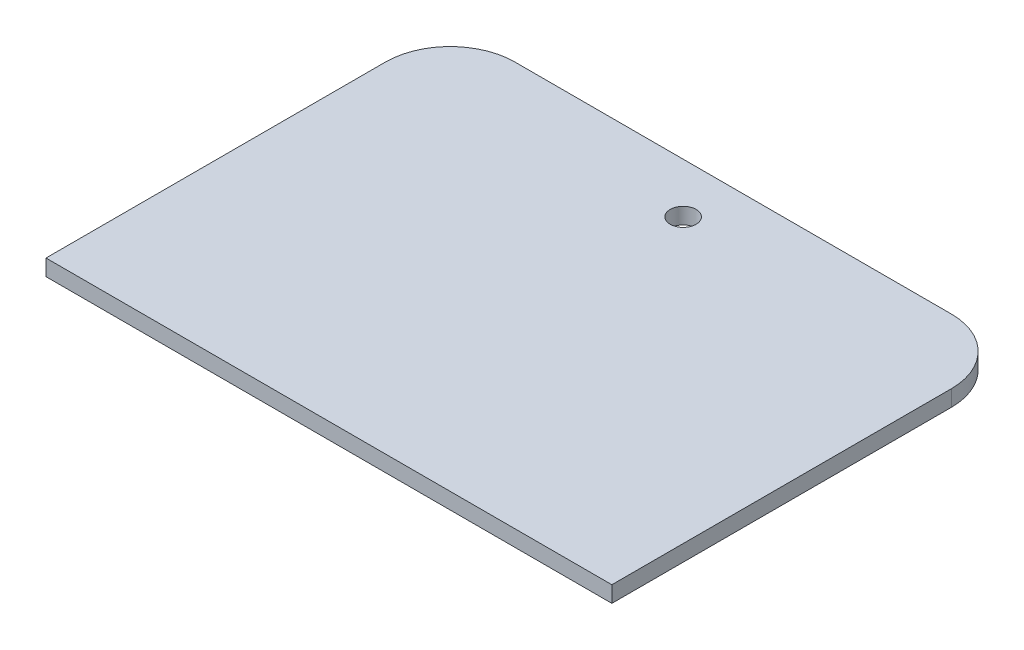
ISO-10303-21;
HEADER;
FILE_DESCRIPTION(('STEP AP214'),'2;1');
FILE_NAME('part.step','',(''),(''),'','','');
FILE_SCHEMA(('AUTOMOTIVE_DESIGN { 1 0 10303 214 1 1 1 1 }'));
ENDSEC;
DATA;
#1=APPLICATION_CONTEXT('core data for automotive mechanical design processes');
#2=APPLICATION_PROTOCOL_DEFINITION('international standard','automotive_design',2000,#1);
#3=PRODUCT_CONTEXT('',#1,'mechanical');
#4=PRODUCT('Part','Part','',(#3));
#5=PRODUCT_RELATED_PRODUCT_CATEGORY('part','',(#4));
#6=PRODUCT_DEFINITION_FORMATION('','',#4);
#7=PRODUCT_DEFINITION_CONTEXT('part definition',#1,'design');
#8=PRODUCT_DEFINITION('design','',#6,#7);
#9=PRODUCT_DEFINITION_SHAPE('','',#8);
#10=(LENGTH_UNIT() NAMED_UNIT(*) SI_UNIT(.MILLI.,.METRE.));
#11=(NAMED_UNIT(*) PLANE_ANGLE_UNIT() SI_UNIT($,.RADIAN.));
#12=(NAMED_UNIT(*) SI_UNIT($,.STERADIAN.) SOLID_ANGLE_UNIT());
#13=UNCERTAINTY_MEASURE_WITH_UNIT(LENGTH_MEASURE(1.E-05),#10,'distance_accuracy_value','');
#14=(GEOMETRIC_REPRESENTATION_CONTEXT(3) GLOBAL_UNCERTAINTY_ASSIGNED_CONTEXT((#13)) GLOBAL_UNIT_ASSIGNED_CONTEXT((#10,
#11,#12)) REPRESENTATION_CONTEXT('',''));
#15=CARTESIAN_POINT('',(0.,0.,0.));
#16=DIRECTION('',(0.,0.,1.));
#17=DIRECTION('',(1.,0.,0.));
#18=AXIS2_PLACEMENT_3D('',#15,#16,#17);
#19=CARTESIAN_POINT('',(35.,2.,-25.));
#20=DIRECTION('',(-1.,0.,0.));
#21=DIRECTION('',(0.,0.,1.));
#22=AXIS2_PLACEMENT_3D('',#19,#20,#21);
#23=PLANE('',#22);
#24=DIRECTION('',(0.,0.,-1.));
#25=VECTOR('',#24,1.);
#26=CARTESIAN_POINT('',(35.,0.,-25.));
#27=LINE('',#26,#25);
#28=CARTESIAN_POINT('',(35.,0.,25.));
#29=VERTEX_POINT('',#28);
#30=CARTESIAN_POINT('',(35.,0.,-17.));
#31=VERTEX_POINT('',#30);
#32=EDGE_CURVE('E113',#29,#31,#27,.T.);
#33=ORIENTED_EDGE('',*,*,#32,.T.);
#34=DIRECTION('',(0.,-1.,0.));
#35=VECTOR('',#34,1.);
#36=CARTESIAN_POINT('',(35.,2.,-17.));
#37=LINE('',#36,#35);
#38=CARTESIAN_POINT('',(35.,2.,-17.));
#39=VERTEX_POINT('',#38);
#40=EDGE_CURVE('E57',#31,#39,#37,.F.);
#41=ORIENTED_EDGE('',*,*,#40,.T.);
#42=DIRECTION('',(0.,0.,-1.));
#43=VECTOR('',#42,1.);
#44=CARTESIAN_POINT('',(35.,2.,-25.));
#45=LINE('',#44,#43);
#46=CARTESIAN_POINT('',(35.,2.,25.));
#47=VERTEX_POINT('',#46);
#48=EDGE_CURVE('E121',#47,#39,#45,.T.);
#49=ORIENTED_EDGE('',*,*,#48,.F.);
#50=DIRECTION('',(0.,-1.,0.));
#51=VECTOR('',#50,1.);
#52=CARTESIAN_POINT('',(35.,2.,25.));
#53=LINE('',#52,#51);
#54=EDGE_CURVE('E105',#47,#29,#53,.T.);
#55=ORIENTED_EDGE('',*,*,#54,.T.);
#56=EDGE_LOOP('',(#33,#41,#49,#55));
#57=FACE_BOUND('',#56,.T.);
#58=ADVANCED_FACE('F34',(#57),#23,.F.);
#59=CARTESIAN_POINT('',(-35.,2.,-25.));
#60=DIRECTION('',(0.,0.,1.));
#61=DIRECTION('',(1.,0.,0.));
#62=AXIS2_PLACEMENT_3D('',#59,#60,#61);
#63=PLANE('',#62);
#64=DIRECTION('',(-1.,0.,0.));
#65=VECTOR('',#64,1.);
#66=CARTESIAN_POINT('',(-35.,2.,-25.));
#67=LINE('',#66,#65);
#68=CARTESIAN_POINT('',(27.,2.,-25.));
#69=VERTEX_POINT('',#68);
#70=CARTESIAN_POINT('',(-27.,2.,-25.));
#71=VERTEX_POINT('',#70);
#72=EDGE_CURVE('E95',#69,#71,#67,.T.);
#73=ORIENTED_EDGE('',*,*,#72,.F.);
#74=DIRECTION('',(0.,-1.,0.));
#75=VECTOR('',#74,1.);
#76=CARTESIAN_POINT('',(27.,2.,-25.));
#77=LINE('',#76,#75);
#78=CARTESIAN_POINT('',(27.,0.,-25.));
#79=VERTEX_POINT('',#78);
#80=EDGE_CURVE('E124',#69,#79,#77,.T.);
#81=ORIENTED_EDGE('',*,*,#80,.T.);
#82=DIRECTION('',(-1.,0.,0.));
#83=VECTOR('',#82,1.);
#84=CARTESIAN_POINT('',(-35.,0.,-25.));
#85=LINE('',#84,#83);
#86=CARTESIAN_POINT('',(-27.,0.,-25.));
#87=VERTEX_POINT('',#86);
#88=EDGE_CURVE('E115',#79,#87,#85,.T.);
#89=ORIENTED_EDGE('',*,*,#88,.T.);
#90=DIRECTION('',(0.,-1.,0.));
#91=VECTOR('',#90,1.);
#92=CARTESIAN_POINT('',(-27.,2.,-25.));
#93=LINE('',#92,#91);
#94=EDGE_CURVE('E104',#87,#71,#93,.F.);
#95=ORIENTED_EDGE('',*,*,#94,.T.);
#96=EDGE_LOOP('',(#73,#81,#89,#95));
#97=FACE_BOUND('',#96,.T.);
#98=ADVANCED_FACE('F137',(#97),#63,.F.);
#99=CARTESIAN_POINT('',(-35.,2.,-25.));
#100=DIRECTION('',(1.,0.,0.));
#101=DIRECTION('',(0.,0.,-1.));
#102=AXIS2_PLACEMENT_3D('',#99,#100,#101);
#103=PLANE('',#102);
#104=DIRECTION('',(0.,0.,1.));
#105=VECTOR('',#104,1.);
#106=CARTESIAN_POINT('',(-35.,2.,-25.));
#107=LINE('',#106,#105);
#108=CARTESIAN_POINT('',(-35.,2.,-17.));
#109=VERTEX_POINT('',#108);
#110=CARTESIAN_POINT('',(-35.,2.,25.));
#111=VERTEX_POINT('',#110);
#112=EDGE_CURVE('E87',#109,#111,#107,.T.);
#113=ORIENTED_EDGE('',*,*,#112,.F.);
#114=DIRECTION('',(0.,-1.,0.));
#115=VECTOR('',#114,1.);
#116=CARTESIAN_POINT('',(-35.,2.,-17.));
#117=LINE('',#116,#115);
#118=CARTESIAN_POINT('',(-35.,0.,-17.));
#119=VERTEX_POINT('',#118);
#120=EDGE_CURVE('E11',#109,#119,#117,.T.);
#121=ORIENTED_EDGE('',*,*,#120,.T.);
#122=DIRECTION('',(0.,0.,1.));
#123=VECTOR('',#122,1.);
#124=CARTESIAN_POINT('',(-35.,0.,-25.));
#125=LINE('',#124,#123);
#126=CARTESIAN_POINT('',(-35.,0.,25.));
#127=VERTEX_POINT('',#126);
#128=EDGE_CURVE('E101',#119,#127,#125,.T.);
#129=ORIENTED_EDGE('',*,*,#128,.T.);
#130=DIRECTION('',(0.,-1.,0.));
#131=VECTOR('',#130,1.);
#132=CARTESIAN_POINT('',(-35.,2.,25.));
#133=LINE('',#132,#131);
#134=EDGE_CURVE('E98',#111,#127,#133,.T.);
#135=ORIENTED_EDGE('',*,*,#134,.F.);
#136=EDGE_LOOP('',(#113,#121,#129,#135));
#137=FACE_BOUND('',#136,.T.);
#138=ADVANCED_FACE('F99',(#137),#103,.F.);
#139=CARTESIAN_POINT('',(-35.,2.,25.));
#140=DIRECTION('',(0.,0.,-1.));
#141=DIRECTION('',(-1.,0.,0.));
#142=AXIS2_PLACEMENT_3D('',#139,#140,#141);
#143=PLANE('',#142);
#144=DIRECTION('',(1.,0.,0.));
#145=VECTOR('',#144,1.);
#146=CARTESIAN_POINT('',(-35.,0.,25.));
#147=LINE('',#146,#145);
#148=EDGE_CURVE('E120',#127,#29,#147,.T.);
#149=ORIENTED_EDGE('',*,*,#148,.T.);
#150=ORIENTED_EDGE('',*,*,#54,.F.);
#151=DIRECTION('',(1.,0.,0.));
#152=VECTOR('',#151,1.);
#153=CARTESIAN_POINT('',(-35.,2.,25.));
#154=LINE('',#153,#152);
#155=EDGE_CURVE('E91',#111,#47,#154,.T.);
#156=ORIENTED_EDGE('',*,*,#155,.F.);
#157=ORIENTED_EDGE('',*,*,#134,.T.);
#158=EDGE_LOOP('',(#149,#150,#156,#157));
#159=FACE_BOUND('',#158,.T.);
#160=ADVANCED_FACE('F107',(#159),#143,.F.);
#161=CARTESIAN_POINT('',(0.,2.,0.));
#162=DIRECTION('',(0.,1.,0.));
#163=DIRECTION('',(0.,0.,1.));
#164=AXIS2_PLACEMENT_3D('',#161,#162,#163);
#165=PLANE('',#164);
#166=CARTESIAN_POINT('',(0.,2.,-18.8196601125011));
#167=DIRECTION('',(0.,1.,0.));
#168=DIRECTION('',(0.,0.,1.));
#169=AXIS2_PLACEMENT_3D('',#166,#167,#168);
#170=CIRCLE('',#169,1.6);
#171=CARTESIAN_POINT('',(0.,2.,-17.2196601125011));
#172=VERTEX_POINT('',#171);
#173=EDGE_CURVE('E148',#172,#172,#170,.T.);
#174=ORIENTED_EDGE('',*,*,#173,.F.);
#175=EDGE_LOOP('',(#174));
#176=FACE_BOUND('',#175,.T.);
#177=ORIENTED_EDGE('',*,*,#48,.T.);
#178=CARTESIAN_POINT('',(27.,2.,-17.));
#179=DIRECTION('',(0.,1.,0.));
#180=DIRECTION('',(0.,0.,1.));
#181=AXIS2_PLACEMENT_3D('',#178,#179,#180);
#182=CIRCLE('',#181,8.);
#183=EDGE_CURVE('E42',#39,#69,#182,.T.);
#184=ORIENTED_EDGE('',*,*,#183,.T.);
#185=ORIENTED_EDGE('',*,*,#72,.T.);
#186=CARTESIAN_POINT('',(-27.,2.,-17.));
#187=DIRECTION('',(0.,1.,0.));
#188=DIRECTION('',(0.,0.,1.));
#189=AXIS2_PLACEMENT_3D('',#186,#187,#188);
#190=CIRCLE('',#189,8.);
#191=EDGE_CURVE('E49',#71,#109,#190,.T.);
#192=ORIENTED_EDGE('',*,*,#191,.T.);
#193=ORIENTED_EDGE('',*,*,#112,.T.);
#194=ORIENTED_EDGE('',*,*,#155,.T.);
#195=EDGE_LOOP('',(#177,#184,#185,#192,#193,#194));
#196=FACE_BOUND('',#195,.T.);
#197=ADVANCED_FACE('F89',(#176,#196),#165,.T.);
#198=CARTESIAN_POINT('',(0.,0.,0.));
#199=DIRECTION('',(0.,1.,0.));
#200=DIRECTION('',(0.,0.,1.));
#201=AXIS2_PLACEMENT_3D('',#198,#199,#200);
#202=PLANE('',#201);
#203=CARTESIAN_POINT('',(0.,0.,-18.8196601125011));
#204=DIRECTION('',(0.,1.,0.));
#205=DIRECTION('',(0.,0.,1.));
#206=AXIS2_PLACEMENT_3D('',#203,#204,#205);
#207=CIRCLE('',#206,1.6);
#208=CARTESIAN_POINT('',(0.,0.,-17.2196601125011));
#209=VERTEX_POINT('',#208);
#210=EDGE_CURVE('E116',#209,#209,#207,.F.);
#211=ORIENTED_EDGE('',*,*,#210,.F.);
#212=EDGE_LOOP('',(#211));
#213=FACE_BOUND('',#212,.T.);
#214=ORIENTED_EDGE('',*,*,#88,.F.);
#215=CARTESIAN_POINT('',(27.,0.,-17.));
#216=DIRECTION('',(0.,1.,0.));
#217=DIRECTION('',(0.,0.,1.));
#218=AXIS2_PLACEMENT_3D('',#215,#216,#217);
#219=CIRCLE('',#218,8.);
#220=EDGE_CURVE('E129',#79,#31,#219,.F.);
#221=ORIENTED_EDGE('',*,*,#220,.T.);
#222=ORIENTED_EDGE('',*,*,#32,.F.);
#223=ORIENTED_EDGE('',*,*,#148,.F.);
#224=ORIENTED_EDGE('',*,*,#128,.F.);
#225=CARTESIAN_POINT('',(-27.,0.,-17.));
#226=DIRECTION('',(0.,1.,0.));
#227=DIRECTION('',(0.,0.,1.));
#228=AXIS2_PLACEMENT_3D('',#225,#226,#227);
#229=CIRCLE('',#228,8.);
#230=EDGE_CURVE('E127',#119,#87,#229,.F.);
#231=ORIENTED_EDGE('',*,*,#230,.T.);
#232=EDGE_LOOP('',(#214,#221,#222,#223,#224,#231));
#233=FACE_BOUND('',#232,.T.);
#234=ADVANCED_FACE('F143',(#213,#233),#202,.F.);
#235=CARTESIAN_POINT('',(27.,2.,-17.));
#236=DIRECTION('',(0.,-1.,0.));
#237=DIRECTION('',(0.,0.,-1.));
#238=AXIS2_PLACEMENT_3D('',#235,#236,#237);
#239=CYLINDRICAL_SURFACE('',#238,8.);
#240=ORIENTED_EDGE('',*,*,#183,.F.);
#241=ORIENTED_EDGE('',*,*,#40,.F.);
#242=ORIENTED_EDGE('',*,*,#220,.F.);
#243=ORIENTED_EDGE('',*,*,#80,.F.);
#244=EDGE_LOOP('',(#240,#241,#242,#243));
#245=FACE_BOUND('',#244,.T.);
#246=ADVANCED_FACE('F140',(#245),#239,.T.);
#247=CARTESIAN_POINT('',(-27.,2.,-17.));
#248=DIRECTION('',(0.,-1.,0.));
#249=DIRECTION('',(0.,0.,-1.));
#250=AXIS2_PLACEMENT_3D('',#247,#248,#249);
#251=CYLINDRICAL_SURFACE('',#250,8.);
#252=ORIENTED_EDGE('',*,*,#191,.F.);
#253=ORIENTED_EDGE('',*,*,#94,.F.);
#254=ORIENTED_EDGE('',*,*,#230,.F.);
#255=ORIENTED_EDGE('',*,*,#120,.F.);
#256=EDGE_LOOP('',(#252,#253,#254,#255));
#257=FACE_BOUND('',#256,.T.);
#258=ADVANCED_FACE('F36',(#257),#251,.T.);
#259=CARTESIAN_POINT('',(0.,-0.00100000000000013,-18.8196601125011));
#260=DIRECTION('',(0.,1.,0.));
#261=DIRECTION('',(0.,0.,1.));
#262=AXIS2_PLACEMENT_3D('',#259,#260,#261);
#263=CYLINDRICAL_SURFACE('',#262,1.6);
#264=ORIENTED_EDGE('',*,*,#173,.T.);
#265=EDGE_LOOP('',(#264));
#266=FACE_BOUND('',#265,.T.);
#267=ORIENTED_EDGE('',*,*,#210,.T.);
#268=EDGE_LOOP('',(#267));
#269=FACE_BOUND('',#268,.T.);
#270=ADVANCED_FACE('F152',(#266,#269),#263,.F.);
#271=CLOSED_SHELL('',(#58,#98,#138,#160,#197,#234,#246,#258,#270));
#272=MANIFOLD_SOLID_BREP('B2',#271);
#273=ADVANCED_BREP_SHAPE_REPRESENTATION('',(#18,#272),#14);
#274=SHAPE_DEFINITION_REPRESENTATION(#9,#273);
ENDSEC;
END-ISO-10303-21;
